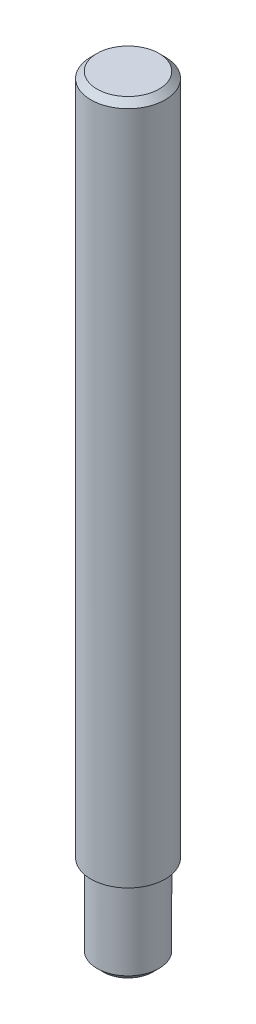
ISO-10303-21;
HEADER;
FILE_DESCRIPTION(('STEP AP214'),'2;1');
FILE_NAME('part.step','',(''),(''),'','','');
FILE_SCHEMA(('AUTOMOTIVE_DESIGN { 1 0 10303 214 1 1 1 1 }'));
ENDSEC;
DATA;
#1=APPLICATION_CONTEXT('core data for automotive mechanical design processes');
#2=APPLICATION_PROTOCOL_DEFINITION('international standard','automotive_design',2000,#1);
#3=PRODUCT_CONTEXT('',#1,'mechanical');
#4=PRODUCT('Part','Part','',(#3));
#5=PRODUCT_RELATED_PRODUCT_CATEGORY('part','',(#4));
#6=PRODUCT_DEFINITION_FORMATION('','',#4);
#7=PRODUCT_DEFINITION_CONTEXT('part definition',#1,'design');
#8=PRODUCT_DEFINITION('design','',#6,#7);
#9=PRODUCT_DEFINITION_SHAPE('','',#8);
#10=(LENGTH_UNIT() NAMED_UNIT(*) SI_UNIT(.MILLI.,.METRE.));
#11=(NAMED_UNIT(*) PLANE_ANGLE_UNIT() SI_UNIT($,.RADIAN.));
#12=(NAMED_UNIT(*) SI_UNIT($,.STERADIAN.) SOLID_ANGLE_UNIT());
#13=UNCERTAINTY_MEASURE_WITH_UNIT(LENGTH_MEASURE(1.E-05),#10,'distance_accuracy_value','');
#14=(GEOMETRIC_REPRESENTATION_CONTEXT(3) GLOBAL_UNCERTAINTY_ASSIGNED_CONTEXT((#13)) GLOBAL_UNIT_ASSIGNED_CONTEXT((#10,
#11,#12)) REPRESENTATION_CONTEXT('',''));
#15=CARTESIAN_POINT('',(0.,0.,0.));
#16=DIRECTION('',(0.,0.,1.));
#17=DIRECTION('',(1.,0.,0.));
#18=AXIS2_PLACEMENT_3D('',#15,#16,#17);
#19=CARTESIAN_POINT('',(1.25,0.,0.));
#20=DIRECTION('',(0.,-1.,0.));
#21=DIRECTION('',(0.,0.,-1.));
#22=AXIS2_PLACEMENT_3D('',#19,#20,#21);
#23=PLANE('',#22);
#24=CARTESIAN_POINT('',(0.,-2.2737335018258E-10,0.));
#25=DIRECTION('',(0.,1.,0.));
#26=DIRECTION('',(-1.,0.,0.));
#27=AXIS2_PLACEMENT_3D('',#24,#25,#26);
#28=CIRCLE('',#27,2.00000000018008);
#29=CARTESIAN_POINT('',(-2.00000000018008,-2.27373610391102E-10,0.));
#30=VERTEX_POINT('',#29);
#31=EDGE_CURVE('E18',#30,#30,#28,.T.);
#32=ORIENTED_EDGE('',*,*,#31,.F.);
#33=EDGE_LOOP('',(#32));
#34=FACE_BOUND('',#33,.T.);
#35=ADVANCED_FACE('F15',(#34),#23,.T.);
#36=CARTESIAN_POINT('',(0.,0.500000000158707,0.));
#37=DIRECTION('',(0.,1.,0.));
#38=DIRECTION('',(-1.,0.,0.));
#39=AXIS2_PLACEMENT_3D('',#36,#37,#38);
#40=CONICAL_SURFACE('',#39,2.49999999965667,0.785398162487953);
#41=ORIENTED_EDGE('',*,*,#31,.T.);
#42=EDGE_LOOP('',(#41));
#43=FACE_BOUND('',#42,.T.);
#44=CARTESIAN_POINT('',(0.,0.500000000000001,0.));
#45=DIRECTION('',(0.,-1.,0.));
#46=DIRECTION('',(1.,0.,0.));
#47=AXIS2_PLACEMENT_3D('',#44,#45,#46);
#48=CIRCLE('',#47,2.5);
#49=CARTESIAN_POINT('',(2.5,0.500000000000002,0.));
#50=VERTEX_POINT('',#49);
#51=EDGE_CURVE('E32',#50,#50,#48,.F.);
#52=ORIENTED_EDGE('',*,*,#51,.F.);
#53=EDGE_LOOP('',(#52));
#54=FACE_BOUND('',#53,.T.);
#55=ADVANCED_FACE('F48',(#43,#54),#40,.T.);
#56=CARTESIAN_POINT('',(0.,3.5,0.));
#57=DIRECTION('',(0.,-1.,0.));
#58=DIRECTION('',(1.,0.,0.));
#59=AXIS2_PLACEMENT_3D('',#56,#57,#58);
#60=CYLINDRICAL_SURFACE('',#59,2.5);
#61=ORIENTED_EDGE('',*,*,#51,.T.);
#62=EDGE_LOOP('',(#61));
#63=FACE_BOUND('',#62,.T.);
#64=CARTESIAN_POINT('',(0.,7.,0.));
#65=DIRECTION('',(0.,-1.,0.));
#66=DIRECTION('',(1.,0.,0.));
#67=AXIS2_PLACEMENT_3D('',#64,#65,#66);
#68=CIRCLE('',#67,2.5);
#69=CARTESIAN_POINT('',(2.5,7.,0.));
#70=VERTEX_POINT('',#69);
#71=EDGE_CURVE('E35',#70,#70,#68,.F.);
#72=ORIENTED_EDGE('',*,*,#71,.F.);
#73=EDGE_LOOP('',(#72));
#74=FACE_BOUND('',#73,.T.);
#75=ADVANCED_FACE('F45',(#63,#74),#60,.T.);
#76=CARTESIAN_POINT('',(1.49999999999999,62.,0.));
#77=DIRECTION('',(0.,1.,0.));
#78=DIRECTION('',(0.,0.,1.));
#79=AXIS2_PLACEMENT_3D('',#76,#77,#78);
#80=PLANE('',#79);
#81=CARTESIAN_POINT('',(0.,62.0000000002392,0.));
#82=DIRECTION('',(0.,-1.,0.));
#83=DIRECTION('',(0.,0.,-1.));
#84=AXIS2_PLACEMENT_3D('',#81,#82,#83);
#85=CIRCLE('',#84,2.50000000016825);
#86=CARTESIAN_POINT('',(0.,62.0000000002392,-2.50000000016825));
#87=VERTEX_POINT('',#86);
#88=EDGE_CURVE('E27',#87,#87,#85,.T.);
#89=ORIENTED_EDGE('',*,*,#88,.F.);
#90=EDGE_LOOP('',(#89));
#91=FACE_BOUND('',#90,.T.);
#92=ADVANCED_FACE('F47',(#91),#80,.T.);
#93=CARTESIAN_POINT('',(2.75,7.,0.));
#94=DIRECTION('',(0.,-1.,0.));
#95=DIRECTION('',(0.,0.,-1.));
#96=AXIS2_PLACEMENT_3D('',#93,#94,#95);
#97=PLANE('',#96);
#98=ORIENTED_EDGE('',*,*,#71,.T.);
#99=EDGE_LOOP('',(#98));
#100=FACE_BOUND('',#99,.T.);
#101=CARTESIAN_POINT('',(0.,7.,0.));
#102=DIRECTION('',(0.,-1.,0.));
#103=DIRECTION('',(1.,0.,0.));
#104=AXIS2_PLACEMENT_3D('',#101,#102,#103);
#105=CIRCLE('',#104,3.);
#106=CARTESIAN_POINT('',(3.,7.,0.));
#107=VERTEX_POINT('',#106);
#108=EDGE_CURVE('E22',#107,#107,#105,.F.);
#109=ORIENTED_EDGE('',*,*,#108,.F.);
#110=EDGE_LOOP('',(#109));
#111=FACE_BOUND('',#110,.T.);
#112=ADVANCED_FACE('F42',(#100,#111),#97,.T.);
#113=CARTESIAN_POINT('',(0.,61.4999999997963,0.));
#114=DIRECTION('',(0.,-1.,0.));
#115=DIRECTION('',(0.,0.,-1.));
#116=AXIS2_PLACEMENT_3D('',#113,#114,#115);
#117=CONICAL_SURFACE('',#116,2.99999999975852,0.785398162544797);
#118=CARTESIAN_POINT('',(0.,61.5,0.));
#119=DIRECTION('',(0.,-1.,0.));
#120=DIRECTION('',(1.,0.,0.));
#121=AXIS2_PLACEMENT_3D('',#118,#119,#120);
#122=CIRCLE('',#121,3.);
#123=CARTESIAN_POINT('',(2.99999999999999,61.5,0.));
#124=VERTEX_POINT('',#123);
#125=EDGE_CURVE('E10',#124,#124,#122,.T.);
#126=ORIENTED_EDGE('',*,*,#125,.F.);
#127=EDGE_LOOP('',(#126));
#128=FACE_BOUND('',#127,.T.);
#129=ORIENTED_EDGE('',*,*,#88,.T.);
#130=EDGE_LOOP('',(#129));
#131=FACE_BOUND('',#130,.T.);
#132=ADVANCED_FACE('F61',(#128,#131),#117,.T.);
#133=CARTESIAN_POINT('',(0.,34.5,0.));
#134=DIRECTION('',(0.,-1.,0.));
#135=DIRECTION('',(1.,0.,0.));
#136=AXIS2_PLACEMENT_3D('',#133,#134,#135);
#137=CYLINDRICAL_SURFACE('',#136,3.);
#138=ORIENTED_EDGE('',*,*,#125,.T.);
#139=EDGE_LOOP('',(#138));
#140=FACE_BOUND('',#139,.T.);
#141=ORIENTED_EDGE('',*,*,#108,.T.);
#142=EDGE_LOOP('',(#141));
#143=FACE_BOUND('',#142,.T.);
#144=ADVANCED_FACE('F59',(#140,#143),#137,.T.);
#145=CLOSED_SHELL('',(#35,#55,#75,#92,#112,#132,#144));
#146=MANIFOLD_SOLID_BREP('B1',#145);
#147=ADVANCED_BREP_SHAPE_REPRESENTATION('',(#18,#146),#14);
#148=SHAPE_DEFINITION_REPRESENTATION(#9,#147);
ENDSEC;
END-ISO-10303-21;
